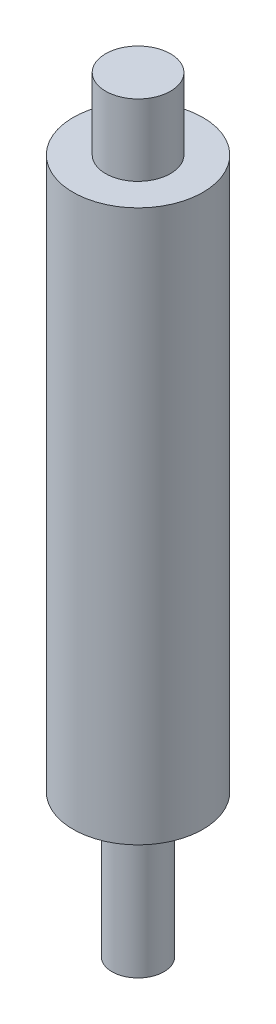
ISO-10303-21;
HEADER;
FILE_DESCRIPTION(('STEP AP214'),'2;1');
FILE_NAME('part.step','',(''),(''),'','','');
FILE_SCHEMA(('AUTOMOTIVE_DESIGN { 1 0 10303 214 1 1 1 1 }'));
ENDSEC;
DATA;
#1=APPLICATION_CONTEXT('core data for automotive mechanical design processes');
#2=APPLICATION_PROTOCOL_DEFINITION('international standard','automotive_design',2000,#1);
#3=PRODUCT_CONTEXT('',#1,'mechanical');
#4=PRODUCT('Part','Part','',(#3));
#5=PRODUCT_RELATED_PRODUCT_CATEGORY('part','',(#4));
#6=PRODUCT_DEFINITION_FORMATION('','',#4);
#7=PRODUCT_DEFINITION_CONTEXT('part definition',#1,'design');
#8=PRODUCT_DEFINITION('design','',#6,#7);
#9=PRODUCT_DEFINITION_SHAPE('','',#8);
#10=(LENGTH_UNIT() NAMED_UNIT(*) SI_UNIT(.MILLI.,.METRE.));
#11=(NAMED_UNIT(*) PLANE_ANGLE_UNIT() SI_UNIT($,.RADIAN.));
#12=(NAMED_UNIT(*) SI_UNIT($,.STERADIAN.) SOLID_ANGLE_UNIT());
#13=UNCERTAINTY_MEASURE_WITH_UNIT(LENGTH_MEASURE(1.E-05),#10,'distance_accuracy_value','');
#14=(GEOMETRIC_REPRESENTATION_CONTEXT(3) GLOBAL_UNCERTAINTY_ASSIGNED_CONTEXT((#13)) GLOBAL_UNIT_ASSIGNED_CONTEXT((#10,
#11,#12)) REPRESENTATION_CONTEXT('',''));
#15=CARTESIAN_POINT('',(0.,0.,0.));
#16=DIRECTION('',(0.,0.,1.));
#17=DIRECTION('',(1.,0.,0.));
#18=AXIS2_PLACEMENT_3D('',#15,#16,#17);
#19=CARTESIAN_POINT('',(-4.,0.,0.));
#20=DIRECTION('',(0.,1.,0.));
#21=DIRECTION('',(0.,0.,1.));
#22=AXIS2_PLACEMENT_3D('',#19,#20,#21);
#23=PLANE('',#22);
#24=CARTESIAN_POINT('',(0.,0.,0.));
#25=DIRECTION('',(0.,-1.,0.));
#26=DIRECTION('',(0.,0.,-1.));
#27=AXIS2_PLACEMENT_3D('',#24,#25,#26);
#28=CIRCLE('',#27,4.);
#29=CARTESIAN_POINT('',(0.,0.,-4.));
#30=VERTEX_POINT('',#29);
#31=EDGE_CURVE('E52',#30,#30,#28,.T.);
#32=ORIENTED_EDGE('',*,*,#31,.T.);
#33=EDGE_LOOP('',(#32));
#34=FACE_BOUND('',#33,.T.);
#35=ADVANCED_FACE('F30',(#34),#23,.F.);
#36=CARTESIAN_POINT('',(0.,118.,0.));
#37=DIRECTION('',(0.,-1.,0.));
#38=DIRECTION('',(0.,0.,-1.));
#39=AXIS2_PLACEMENT_3D('',#36,#37,#38);
#40=PLANE('',#39);
#41=CARTESIAN_POINT('',(0.,118.,0.));
#42=DIRECTION('',(0.,-1.,0.));
#43=DIRECTION('',(0.,0.,-1.));
#44=AXIS2_PLACEMENT_3D('',#41,#42,#43);
#45=CIRCLE('',#44,5.);
#46=CARTESIAN_POINT('',(0.,118.,-5.));
#47=VERTEX_POINT('',#46);
#48=EDGE_CURVE('E10',#47,#47,#45,.T.);
#49=ORIENTED_EDGE('',*,*,#48,.F.);
#50=EDGE_LOOP('',(#49));
#51=FACE_BOUND('',#50,.T.);
#52=ADVANCED_FACE('F82',(#51),#40,.F.);
#53=CARTESIAN_POINT('',(0.,0.,0.));
#54=DIRECTION('',(0.,-1.,0.));
#55=DIRECTION('',(0.,0.,-1.));
#56=AXIS2_PLACEMENT_3D('',#53,#54,#55);
#57=CYLINDRICAL_SURFACE('',#56,5.);
#58=CARTESIAN_POINT('',(0.,107.,0.));
#59=DIRECTION('',(0.,-1.,0.));
#60=DIRECTION('',(0.,0.,-1.));
#61=AXIS2_PLACEMENT_3D('',#58,#59,#60);
#62=CIRCLE('',#61,5.);
#63=CARTESIAN_POINT('',(0.,107.,-5.));
#64=VERTEX_POINT('',#63);
#65=EDGE_CURVE('E36',#64,#64,#62,.T.);
#66=ORIENTED_EDGE('',*,*,#65,.F.);
#67=EDGE_LOOP('',(#66));
#68=FACE_BOUND('',#67,.T.);
#69=ORIENTED_EDGE('',*,*,#48,.T.);
#70=EDGE_LOOP('',(#69));
#71=FACE_BOUND('',#70,.T.);
#72=ADVANCED_FACE('F77',(#68,#71),#57,.T.);
#73=CARTESIAN_POINT('',(-5.,107.,0.));
#74=DIRECTION('',(0.,-1.,0.));
#75=DIRECTION('',(0.,0.,-1.));
#76=AXIS2_PLACEMENT_3D('',#73,#74,#75);
#77=PLANE('',#76);
#78=CARTESIAN_POINT('',(0.,107.,0.));
#79=DIRECTION('',(0.,-1.,0.));
#80=DIRECTION('',(0.,0.,-1.));
#81=AXIS2_PLACEMENT_3D('',#78,#79,#80);
#82=CIRCLE('',#81,10.);
#83=CARTESIAN_POINT('',(0.,107.,-10.));
#84=VERTEX_POINT('',#83);
#85=EDGE_CURVE('E40',#84,#84,#82,.T.);
#86=ORIENTED_EDGE('',*,*,#85,.F.);
#87=EDGE_LOOP('',(#86));
#88=FACE_BOUND('',#87,.T.);
#89=ORIENTED_EDGE('',*,*,#65,.T.);
#90=EDGE_LOOP('',(#89));
#91=FACE_BOUND('',#90,.T.);
#92=ADVANCED_FACE('F72',(#88,#91),#77,.F.);
#93=CARTESIAN_POINT('',(0.,0.,0.));
#94=DIRECTION('',(0.,-1.,0.));
#95=DIRECTION('',(0.,0.,-1.));
#96=AXIS2_PLACEMENT_3D('',#93,#94,#95);
#97=CYLINDRICAL_SURFACE('',#96,9.99999999999999);
#98=CARTESIAN_POINT('',(0.,22.,0.));
#99=DIRECTION('',(0.,-1.,0.));
#100=DIRECTION('',(0.,0.,-1.));
#101=AXIS2_PLACEMENT_3D('',#98,#99,#100);
#102=CIRCLE('',#101,9.99999999999999);
#103=CARTESIAN_POINT('',(0.,22.,-9.99999999999999));
#104=VERTEX_POINT('',#103);
#105=EDGE_CURVE('E44',#104,#104,#102,.T.);
#106=ORIENTED_EDGE('',*,*,#105,.F.);
#107=EDGE_LOOP('',(#106));
#108=FACE_BOUND('',#107,.T.);
#109=ORIENTED_EDGE('',*,*,#85,.T.);
#110=EDGE_LOOP('',(#109));
#111=FACE_BOUND('',#110,.T.);
#112=ADVANCED_FACE('F66',(#108,#111),#97,.T.);
#113=CARTESIAN_POINT('',(-9.99999999999999,22.,0.));
#114=DIRECTION('',(0.,1.,0.));
#115=DIRECTION('',(0.,0.,1.));
#116=AXIS2_PLACEMENT_3D('',#113,#114,#115);
#117=PLANE('',#116);
#118=CARTESIAN_POINT('',(0.,22.,0.));
#119=DIRECTION('',(0.,-1.,0.));
#120=DIRECTION('',(0.,0.,-1.));
#121=AXIS2_PLACEMENT_3D('',#118,#119,#120);
#122=CIRCLE('',#121,4.);
#123=CARTESIAN_POINT('',(0.,22.,-4.));
#124=VERTEX_POINT('',#123);
#125=EDGE_CURVE('E49',#124,#124,#122,.T.);
#126=ORIENTED_EDGE('',*,*,#125,.F.);
#127=EDGE_LOOP('',(#126));
#128=FACE_BOUND('',#127,.T.);
#129=ORIENTED_EDGE('',*,*,#105,.T.);
#130=EDGE_LOOP('',(#129));
#131=FACE_BOUND('',#130,.T.);
#132=ADVANCED_FACE('F60',(#128,#131),#117,.F.);
#133=CARTESIAN_POINT('',(0.,0.,0.));
#134=DIRECTION('',(0.,-1.,0.));
#135=DIRECTION('',(0.,0.,-1.));
#136=AXIS2_PLACEMENT_3D('',#133,#134,#135);
#137=CYLINDRICAL_SURFACE('',#136,4.);
#138=ORIENTED_EDGE('',*,*,#31,.F.);
#139=EDGE_LOOP('',(#138));
#140=FACE_BOUND('',#139,.T.);
#141=ORIENTED_EDGE('',*,*,#125,.T.);
#142=EDGE_LOOP('',(#141));
#143=FACE_BOUND('',#142,.T.);
#144=ADVANCED_FACE('F57',(#140,#143),#137,.T.);
#145=CLOSED_SHELL('',(#35,#52,#72,#92,#112,#132,#144));
#146=MANIFOLD_SOLID_BREP('B2',#145);
#147=ADVANCED_BREP_SHAPE_REPRESENTATION('',(#18,#146),#14);
#148=SHAPE_DEFINITION_REPRESENTATION(#9,#147);
ENDSEC;
END-ISO-10303-21;
